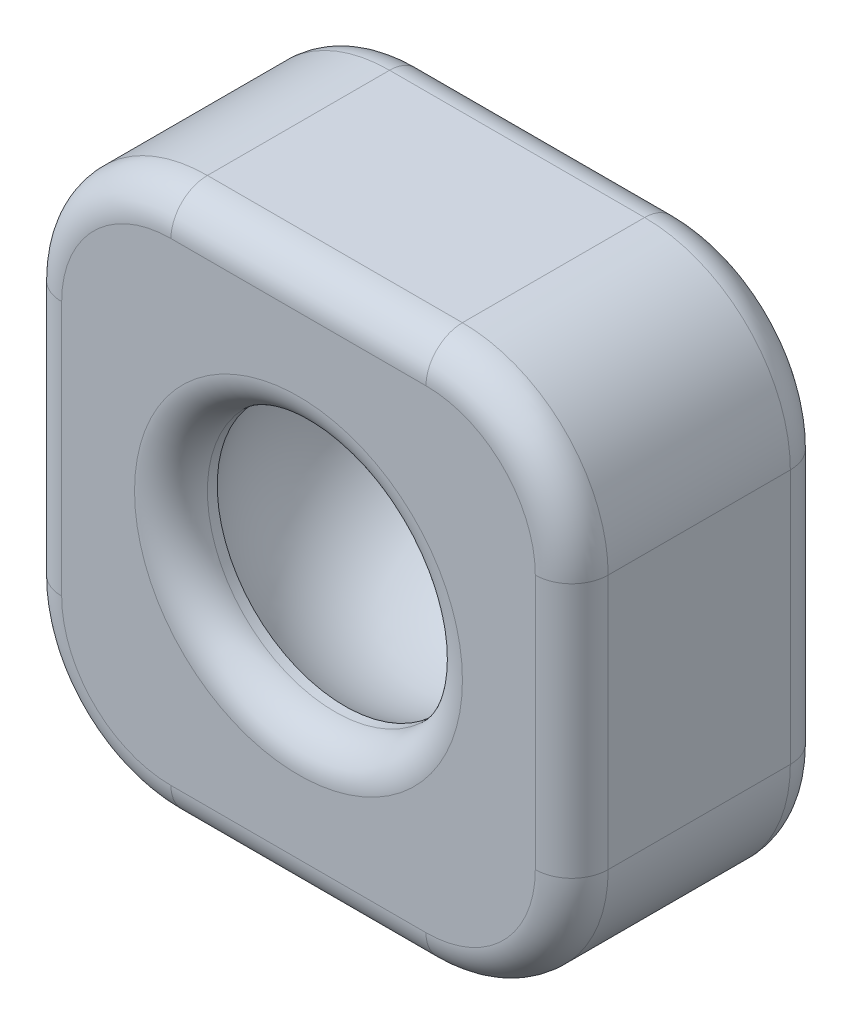
ISO-10303-21;
HEADER;
FILE_DESCRIPTION(('STEP AP214'),'2;1');
FILE_NAME('part.step','',(''),(''),'','','');
FILE_SCHEMA(('AUTOMOTIVE_DESIGN { 1 0 10303 214 1 1 1 1 }'));
ENDSEC;
DATA;
#1=APPLICATION_CONTEXT('core data for automotive mechanical design processes');
#2=APPLICATION_PROTOCOL_DEFINITION('international standard','automotive_design',2000,#1);
#3=PRODUCT_CONTEXT('',#1,'mechanical');
#4=PRODUCT('Part','Part','',(#3));
#5=PRODUCT_RELATED_PRODUCT_CATEGORY('part','',(#4));
#6=PRODUCT_DEFINITION_FORMATION('','',#4);
#7=PRODUCT_DEFINITION_CONTEXT('part definition',#1,'design');
#8=PRODUCT_DEFINITION('design','',#6,#7);
#9=PRODUCT_DEFINITION_SHAPE('','',#8);
#10=(LENGTH_UNIT() NAMED_UNIT(*) SI_UNIT(.MILLI.,.METRE.));
#11=(NAMED_UNIT(*) PLANE_ANGLE_UNIT() SI_UNIT($,.RADIAN.));
#12=(NAMED_UNIT(*) SI_UNIT($,.STERADIAN.) SOLID_ANGLE_UNIT());
#13=UNCERTAINTY_MEASURE_WITH_UNIT(LENGTH_MEASURE(1.E-05),#10,'distance_accuracy_value','');
#14=(GEOMETRIC_REPRESENTATION_CONTEXT(3) GLOBAL_UNCERTAINTY_ASSIGNED_CONTEXT((#13)) GLOBAL_UNIT_ASSIGNED_CONTEXT((#10,
#11,#12)) REPRESENTATION_CONTEXT('',''));
#15=CARTESIAN_POINT('',(0.,0.,0.));
#16=DIRECTION('',(0.,0.,1.));
#17=DIRECTION('',(1.,0.,0.));
#18=AXIS2_PLACEMENT_3D('',#15,#16,#17);
#19=CARTESIAN_POINT('',(0.,0.,8.5));
#20=DIRECTION('',(0.,0.,-1.));
#21=DIRECTION('',(-1.,0.,0.));
#22=AXIS2_PLACEMENT_3D('',#19,#20,#21);
#23=CYLINDRICAL_SURFACE('',#22,3.5);
#24=CARTESIAN_POINT('',(0.,0.,2.5));
#25=DIRECTION('',(0.,0.,1.));
#26=DIRECTION('',(1.,0.,0.));
#27=AXIS2_PLACEMENT_3D('',#24,#25,#26);
#28=CIRCLE('',#27,3.5);
#29=CARTESIAN_POINT('',(3.5,0.,2.5));
#30=VERTEX_POINT('',#29);
#31=EDGE_CURVE('E11',#30,#30,#28,.F.);
#32=ORIENTED_EDGE('',*,*,#31,.T.);
#33=EDGE_LOOP('',(#32));
#34=FACE_BOUND('',#33,.T.);
#35=CARTESIAN_POINT('',(0.,0.,2.77008968790222));
#36=DIRECTION('',(0.,0.,1.));
#37=DIRECTION('',(1.,0.,0.));
#38=AXIS2_PLACEMENT_3D('',#35,#36,#37);
#39=CIRCLE('',#38,3.5);
#40=CARTESIAN_POINT('',(3.5,0.,2.77008968790222));
#41=VERTEX_POINT('',#40);
#42=EDGE_CURVE('E368',#41,#41,#39,.T.);
#43=ORIENTED_EDGE('',*,*,#42,.T.);
#44=EDGE_LOOP('',(#43));
#45=FACE_BOUND('',#44,.T.);
#46=ADVANCED_FACE('F33',(#34,#45),#23,.F.);
#47=CARTESIAN_POINT('',(0.,0.,8.5));
#48=DIRECTION('',(0.,0.,1.));
#49=DIRECTION('',(1.,0.,0.));
#50=AXIS2_PLACEMENT_3D('',#47,#48,#49);
#51=PLANE('',#50);
#52=CARTESIAN_POINT('',(0.,0.,8.5));
#53=DIRECTION('',(0.,0.,1.));
#54=DIRECTION('',(1.,0.,0.));
#55=AXIS2_PLACEMENT_3D('',#52,#53,#54);
#56=CIRCLE('',#55,4.5);
#57=CARTESIAN_POINT('',(4.5,0.,8.5));
#58=VERTEX_POINT('',#57);
#59=EDGE_CURVE('E174',#58,#58,#56,.F.);
#60=ORIENTED_EDGE('',*,*,#59,.T.);
#61=EDGE_LOOP('',(#60));
#62=FACE_BOUND('',#61,.T.);
#63=DIRECTION('',(0.,-1.,0.));
#64=VECTOR('',#63,1.);
#65=CARTESIAN_POINT('',(-6.5,-3.49999999999999,8.5));
#66=LINE('',#65,#64);
#67=CARTESIAN_POINT('',(-6.5,3.5,8.5));
#68=VERTEX_POINT('',#67);
#69=CARTESIAN_POINT('',(-6.5,-3.5,8.5));
#70=VERTEX_POINT('',#69);
#71=EDGE_CURVE('E172',#68,#70,#66,.T.);
#72=ORIENTED_EDGE('',*,*,#71,.T.);
#73=CARTESIAN_POINT('',(-3.5,-3.5,8.5));
#74=DIRECTION('',(0.,0.,1.));
#75=DIRECTION('',(1.,0.,0.));
#76=AXIS2_PLACEMENT_3D('',#73,#74,#75);
#77=CIRCLE('',#76,3.);
#78=CARTESIAN_POINT('',(-3.5,-6.5,8.5));
#79=VERTEX_POINT('',#78);
#80=EDGE_CURVE('E153',#70,#79,#77,.T.);
#81=ORIENTED_EDGE('',*,*,#80,.T.);
#82=DIRECTION('',(1.,0.,0.));
#83=VECTOR('',#82,1.);
#84=CARTESIAN_POINT('',(3.5,-6.5,8.5));
#85=LINE('',#84,#83);
#86=CARTESIAN_POINT('',(3.5,-6.5,8.5));
#87=VERTEX_POINT('',#86);
#88=EDGE_CURVE('E161',#79,#87,#85,.T.);
#89=ORIENTED_EDGE('',*,*,#88,.T.);
#90=CARTESIAN_POINT('',(3.5,-3.5,8.5));
#91=DIRECTION('',(0.,0.,1.));
#92=DIRECTION('',(1.,0.,0.));
#93=AXIS2_PLACEMENT_3D('',#90,#91,#92);
#94=CIRCLE('',#93,3.);
#95=CARTESIAN_POINT('',(6.5,-3.5,8.5));
#96=VERTEX_POINT('',#95);
#97=EDGE_CURVE('E167',#87,#96,#94,.T.);
#98=ORIENTED_EDGE('',*,*,#97,.T.);
#99=DIRECTION('',(0.,1.,0.));
#100=VECTOR('',#99,1.);
#101=CARTESIAN_POINT('',(6.5,3.5,8.5));
#102=LINE('',#101,#100);
#103=CARTESIAN_POINT('',(6.5,3.5,8.5));
#104=VERTEX_POINT('',#103);
#105=EDGE_CURVE('E314',#96,#104,#102,.T.);
#106=ORIENTED_EDGE('',*,*,#105,.T.);
#107=CARTESIAN_POINT('',(3.5,3.5,8.5));
#108=DIRECTION('',(0.,0.,1.));
#109=DIRECTION('',(1.,0.,0.));
#110=AXIS2_PLACEMENT_3D('',#107,#108,#109);
#111=CIRCLE('',#110,3.);
#112=CARTESIAN_POINT('',(3.5,6.5,8.5));
#113=VERTEX_POINT('',#112);
#114=EDGE_CURVE('E316',#104,#113,#111,.T.);
#115=ORIENTED_EDGE('',*,*,#114,.T.);
#116=DIRECTION('',(-1.,0.,0.));
#117=VECTOR('',#116,1.);
#118=CARTESIAN_POINT('',(-3.5,6.5,8.5));
#119=LINE('',#118,#117);
#120=CARTESIAN_POINT('',(-3.5,6.5,8.5));
#121=VERTEX_POINT('',#120);
#122=EDGE_CURVE('E318',#113,#121,#119,.T.);
#123=ORIENTED_EDGE('',*,*,#122,.T.);
#124=CARTESIAN_POINT('',(-3.5,3.5,8.5));
#125=DIRECTION('',(0.,0.,1.));
#126=DIRECTION('',(1.,0.,0.));
#127=AXIS2_PLACEMENT_3D('',#124,#125,#126);
#128=CIRCLE('',#127,3.);
#129=EDGE_CURVE('E179',#121,#68,#128,.T.);
#130=ORIENTED_EDGE('',*,*,#129,.T.);
#131=EDGE_LOOP('',(#72,#81,#89,#98,#106,#115,#123,#130));
#132=FACE_BOUND('',#131,.T.);
#133=ADVANCED_FACE('F170',(#62,#132),#51,.T.);
#134=CARTESIAN_POINT('',(-7.5,7.5,8.5));
#135=DIRECTION('',(1.,0.,0.));
#136=DIRECTION('',(0.,1.,0.));
#137=AXIS2_PLACEMENT_3D('',#134,#135,#136);
#138=PLANE('',#137);
#139=DIRECTION('',(0.,0.,-1.));
#140=VECTOR('',#139,1.);
#141=CARTESIAN_POINT('',(-7.5,-3.5,8.5));
#142=LINE('',#141,#140);
#143=CARTESIAN_POINT('',(-7.5,-3.5,2.5));
#144=VERTEX_POINT('',#143);
#145=CARTESIAN_POINT('',(-7.5,-3.5,7.5));
#146=VERTEX_POINT('',#145);
#147=EDGE_CURVE('E287',#144,#146,#142,.F.);
#148=ORIENTED_EDGE('',*,*,#147,.T.);
#149=DIRECTION('',(0.,-1.,0.));
#150=VECTOR('',#149,1.);
#151=CARTESIAN_POINT('',(-7.5,3.5,7.5));
#152=LINE('',#151,#150);
#153=CARTESIAN_POINT('',(-7.5,3.5,7.5));
#154=VERTEX_POINT('',#153);
#155=EDGE_CURVE('E187',#146,#154,#152,.F.);
#156=ORIENTED_EDGE('',*,*,#155,.T.);
#157=DIRECTION('',(0.,0.,-1.));
#158=VECTOR('',#157,1.);
#159=CARTESIAN_POINT('',(-7.5,3.5,8.5));
#160=LINE('',#159,#158);
#161=CARTESIAN_POINT('',(-7.5,3.5,2.5));
#162=VERTEX_POINT('',#161);
#163=EDGE_CURVE('E308',#154,#162,#160,.T.);
#164=ORIENTED_EDGE('',*,*,#163,.T.);
#165=DIRECTION('',(0.,-1.,0.));
#166=VECTOR('',#165,1.);
#167=CARTESIAN_POINT('',(-7.5,7.5,2.5));
#168=LINE('',#167,#166);
#169=EDGE_CURVE('E185',#162,#144,#168,.T.);
#170=ORIENTED_EDGE('',*,*,#169,.T.);
#171=EDGE_LOOP('',(#148,#156,#164,#170));
#172=FACE_BOUND('',#171,.T.);
#173=ADVANCED_FACE('F331',(#172),#138,.F.);
#174=CARTESIAN_POINT('',(-7.5,-7.5,8.5));
#175=DIRECTION('',(0.,1.,0.));
#176=DIRECTION('',(0.,0.,1.));
#177=AXIS2_PLACEMENT_3D('',#174,#175,#176);
#178=PLANE('',#177);
#179=DIRECTION('',(0.,0.,-1.));
#180=VECTOR('',#179,1.);
#181=CARTESIAN_POINT('',(3.5,-7.5,8.5));
#182=LINE('',#181,#180);
#183=CARTESIAN_POINT('',(3.5,-7.5,2.5));
#184=VERTEX_POINT('',#183);
#185=CARTESIAN_POINT('',(3.5,-7.5,7.5));
#186=VERTEX_POINT('',#185);
#187=EDGE_CURVE('E292',#184,#186,#182,.F.);
#188=ORIENTED_EDGE('',*,*,#187,.T.);
#189=DIRECTION('',(1.,0.,0.));
#190=VECTOR('',#189,1.);
#191=CARTESIAN_POINT('',(-3.5,-7.5,7.5));
#192=LINE('',#191,#190);
#193=CARTESIAN_POINT('',(-3.5,-7.5,7.5));
#194=VERTEX_POINT('',#193);
#195=EDGE_CURVE('E212',#186,#194,#192,.F.);
#196=ORIENTED_EDGE('',*,*,#195,.T.);
#197=DIRECTION('',(0.,0.,-1.));
#198=VECTOR('',#197,1.);
#199=CARTESIAN_POINT('',(-3.5,-7.5,8.5));
#200=LINE('',#199,#198);
#201=CARTESIAN_POINT('',(-3.5,-7.5,2.5));
#202=VERTEX_POINT('',#201);
#203=EDGE_CURVE('E285',#194,#202,#200,.T.);
#204=ORIENTED_EDGE('',*,*,#203,.T.);
#205=DIRECTION('',(1.,0.,0.));
#206=VECTOR('',#205,1.);
#207=CARTESIAN_POINT('',(-7.5,-7.5,2.5));
#208=LINE('',#207,#206);
#209=EDGE_CURVE('E210',#202,#184,#208,.T.);
#210=ORIENTED_EDGE('',*,*,#209,.T.);
#211=EDGE_LOOP('',(#188,#196,#204,#210));
#212=FACE_BOUND('',#211,.T.);
#213=ADVANCED_FACE('F290',(#212),#178,.F.);
#214=CARTESIAN_POINT('',(7.5,-7.5,8.5));
#215=DIRECTION('',(-1.,0.,0.));
#216=DIRECTION('',(0.,0.,1.));
#217=AXIS2_PLACEMENT_3D('',#214,#215,#216);
#218=PLANE('',#217);
#219=DIRECTION('',(0.,0.,-1.));
#220=VECTOR('',#219,1.);
#221=CARTESIAN_POINT('',(7.5,3.5,8.5));
#222=LINE('',#221,#220);
#223=CARTESIAN_POINT('',(7.5,3.5,2.5));
#224=VERTEX_POINT('',#223);
#225=CARTESIAN_POINT('',(7.5,3.5,7.5));
#226=VERTEX_POINT('',#225);
#227=EDGE_CURVE('E298',#224,#226,#222,.F.);
#228=ORIENTED_EDGE('',*,*,#227,.T.);
#229=DIRECTION('',(0.,1.,0.));
#230=VECTOR('',#229,1.);
#231=CARTESIAN_POINT('',(7.5,-3.5,7.5));
#232=LINE('',#231,#230);
#233=CARTESIAN_POINT('',(7.5,-3.5,7.5));
#234=VERTEX_POINT('',#233);
#235=EDGE_CURVE('E204',#226,#234,#232,.F.);
#236=ORIENTED_EDGE('',*,*,#235,.T.);
#237=DIRECTION('',(0.,0.,-1.));
#238=VECTOR('',#237,1.);
#239=CARTESIAN_POINT('',(7.5,-3.5,8.5));
#240=LINE('',#239,#238);
#241=CARTESIAN_POINT('',(7.5,-3.5,2.5));
#242=VERTEX_POINT('',#241);
#243=EDGE_CURVE('E293',#234,#242,#240,.T.);
#244=ORIENTED_EDGE('',*,*,#243,.T.);
#245=DIRECTION('',(0.,1.,0.));
#246=VECTOR('',#245,1.);
#247=CARTESIAN_POINT('',(7.5,-7.5,2.5));
#248=LINE('',#247,#246);
#249=EDGE_CURVE('E202',#242,#224,#248,.T.);
#250=ORIENTED_EDGE('',*,*,#249,.T.);
#251=EDGE_LOOP('',(#228,#236,#244,#250));
#252=FACE_BOUND('',#251,.T.);
#253=ADVANCED_FACE('F361',(#252),#218,.F.);
#254=CARTESIAN_POINT('',(7.5,7.5,8.5));
#255=DIRECTION('',(0.,-1.,0.));
#256=DIRECTION('',(1.,0.,0.));
#257=AXIS2_PLACEMENT_3D('',#254,#255,#256);
#258=PLANE('',#257);
#259=DIRECTION('',(0.,0.,-1.));
#260=VECTOR('',#259,1.);
#261=CARTESIAN_POINT('',(-3.5,7.5,8.5));
#262=LINE('',#261,#260);
#263=CARTESIAN_POINT('',(-3.5,7.5,2.5));
#264=VERTEX_POINT('',#263);
#265=CARTESIAN_POINT('',(-3.5,7.5,7.5));
#266=VERTEX_POINT('',#265);
#267=EDGE_CURVE('E295',#264,#266,#262,.F.);
#268=ORIENTED_EDGE('',*,*,#267,.T.);
#269=DIRECTION('',(-1.,0.,0.));
#270=VECTOR('',#269,1.);
#271=CARTESIAN_POINT('',(3.5,7.5,7.5));
#272=LINE('',#271,#270);
#273=CARTESIAN_POINT('',(3.5,7.5,7.5));
#274=VERTEX_POINT('',#273);
#275=EDGE_CURVE('E195',#266,#274,#272,.F.);
#276=ORIENTED_EDGE('',*,*,#275,.T.);
#277=DIRECTION('',(0.,0.,-1.));
#278=VECTOR('',#277,1.);
#279=CARTESIAN_POINT('',(3.5,7.5,8.5));
#280=LINE('',#279,#278);
#281=CARTESIAN_POINT('',(3.5,7.5,2.5));
#282=VERTEX_POINT('',#281);
#283=EDGE_CURVE('E304',#274,#282,#280,.T.);
#284=ORIENTED_EDGE('',*,*,#283,.T.);
#285=DIRECTION('',(-1.,0.,0.));
#286=VECTOR('',#285,1.);
#287=CARTESIAN_POINT('',(7.5,7.5,2.5));
#288=LINE('',#287,#286);
#289=EDGE_CURVE('E193',#282,#264,#288,.T.);
#290=ORIENTED_EDGE('',*,*,#289,.T.);
#291=EDGE_LOOP('',(#268,#276,#284,#290));
#292=FACE_BOUND('',#291,.T.);
#293=ADVANCED_FACE('F379',(#292),#258,.F.);
#294=CARTESIAN_POINT('',(0.,0.,7.5));
#295=DIRECTION('',(0.,0.,1.));
#296=DIRECTION('',(1.,0.,0.));
#297=AXIS2_PLACEMENT_3D('',#294,#295,#296);
#298=CIRCLE('',#297,3.5);
#299=CARTESIAN_POINT('',(3.5,0.,7.5));
#300=VERTEX_POINT('',#299);
#301=EDGE_CURVE('E168',#300,#300,#298,.T.);
#302=ORIENTED_EDGE('',*,*,#301,.T.);
#303=EDGE_LOOP('',(#302));
#304=FACE_BOUND('',#303,.T.);
#305=CARTESIAN_POINT('',(0.,0.,7.22991031209778));
#306=DIRECTION('',(0.,0.,1.));
#307=DIRECTION('',(1.,0.,0.));
#308=AXIS2_PLACEMENT_3D('',#305,#306,#307);
#309=CIRCLE('',#308,3.5);
#310=CARTESIAN_POINT('',(3.5,0.,7.22991031209777));
#311=VERTEX_POINT('',#310);
#312=EDGE_CURVE('E247',#311,#311,#309,.T.);
#313=ORIENTED_EDGE('',*,*,#312,.F.);
#314=EDGE_LOOP('',(#313));
#315=FACE_BOUND('',#314,.T.);
#316=ADVANCED_FACE('F377',(#304,#315),#23,.F.);
#317=CARTESIAN_POINT('',(0.,0.,1.5));
#318=DIRECTION('',(0.,0.,1.));
#319=DIRECTION('',(1.,0.,0.));
#320=AXIS2_PLACEMENT_3D('',#317,#318,#319);
#321=PLANE('',#320);
#322=DIRECTION('',(-1.,0.,0.));
#323=VECTOR('',#322,1.);
#324=CARTESIAN_POINT('',(0.,6.5,1.5));
#325=LINE('',#324,#323);
#326=CARTESIAN_POINT('',(-3.5,6.5,1.5));
#327=VERTEX_POINT('',#326);
#328=CARTESIAN_POINT('',(3.5,6.5,1.5));
#329=VERTEX_POINT('',#328);
#330=EDGE_CURVE('E50',#327,#329,#325,.F.);
#331=ORIENTED_EDGE('',*,*,#330,.T.);
#332=CARTESIAN_POINT('',(3.5,3.5,1.5));
#333=DIRECTION('',(0.,0.,1.));
#334=DIRECTION('',(1.,0.,0.));
#335=AXIS2_PLACEMENT_3D('',#332,#333,#334);
#336=CIRCLE('',#335,3.);
#337=CARTESIAN_POINT('',(6.5,3.5,1.5));
#338=VERTEX_POINT('',#337);
#339=EDGE_CURVE('E42',#329,#338,#336,.F.);
#340=ORIENTED_EDGE('',*,*,#339,.T.);
#341=DIRECTION('',(0.,1.,0.));
#342=VECTOR('',#341,1.);
#343=CARTESIAN_POINT('',(6.5,0.,1.5));
#344=LINE('',#343,#342);
#345=CARTESIAN_POINT('',(6.5,-3.5,1.5));
#346=VERTEX_POINT('',#345);
#347=EDGE_CURVE('E217',#338,#346,#344,.F.);
#348=ORIENTED_EDGE('',*,*,#347,.T.);
#349=CARTESIAN_POINT('',(3.5,-3.5,1.5));
#350=DIRECTION('',(0.,0.,1.));
#351=DIRECTION('',(1.,0.,0.));
#352=AXIS2_PLACEMENT_3D('',#349,#350,#351);
#353=CIRCLE('',#352,3.);
#354=CARTESIAN_POINT('',(3.5,-6.5,1.5));
#355=VERTEX_POINT('',#354);
#356=EDGE_CURVE('E219',#346,#355,#353,.F.);
#357=ORIENTED_EDGE('',*,*,#356,.T.);
#358=DIRECTION('',(1.,0.,0.));
#359=VECTOR('',#358,1.);
#360=CARTESIAN_POINT('',(0.,-6.5,1.5));
#361=LINE('',#360,#359);
#362=CARTESIAN_POINT('',(-3.5,-6.5,1.5));
#363=VERTEX_POINT('',#362);
#364=EDGE_CURVE('E221',#355,#363,#361,.F.);
#365=ORIENTED_EDGE('',*,*,#364,.T.);
#366=CARTESIAN_POINT('',(-3.5,-3.5,1.5));
#367=DIRECTION('',(0.,0.,1.));
#368=DIRECTION('',(1.,0.,0.));
#369=AXIS2_PLACEMENT_3D('',#366,#367,#368);
#370=CIRCLE('',#369,3.);
#371=CARTESIAN_POINT('',(-6.5,-3.5,1.5));
#372=VERTEX_POINT('',#371);
#373=EDGE_CURVE('E223',#363,#372,#370,.F.);
#374=ORIENTED_EDGE('',*,*,#373,.T.);
#375=DIRECTION('',(0.,-1.,0.));
#376=VECTOR('',#375,1.);
#377=CARTESIAN_POINT('',(-6.5,0.,1.5));
#378=LINE('',#377,#376);
#379=CARTESIAN_POINT('',(-6.5,3.5,1.5));
#380=VERTEX_POINT('',#379);
#381=EDGE_CURVE('E225',#372,#380,#378,.F.);
#382=ORIENTED_EDGE('',*,*,#381,.T.);
#383=CARTESIAN_POINT('',(-3.5,3.5,1.5));
#384=DIRECTION('',(0.,0.,1.));
#385=DIRECTION('',(1.,0.,0.));
#386=AXIS2_PLACEMENT_3D('',#383,#384,#385);
#387=CIRCLE('',#386,3.);
#388=EDGE_CURVE('E55',#380,#327,#387,.F.);
#389=ORIENTED_EDGE('',*,*,#388,.T.);
#390=EDGE_LOOP('',(#331,#340,#348,#357,#365,#374,#382,#389));
#391=FACE_BOUND('',#390,.T.);
#392=CARTESIAN_POINT('',(0.,0.,1.5));
#393=DIRECTION('',(0.,0.,1.));
#394=DIRECTION('',(1.,0.,0.));
#395=AXIS2_PLACEMENT_3D('',#392,#393,#394);
#396=CIRCLE('',#395,4.5);
#397=CARTESIAN_POINT('',(4.5,0.,1.5));
#398=VERTEX_POINT('',#397);
#399=EDGE_CURVE('E214',#398,#398,#396,.T.);
#400=ORIENTED_EDGE('',*,*,#399,.T.);
#401=EDGE_LOOP('',(#400));
#402=FACE_BOUND('',#401,.T.);
#403=ADVANCED_FACE('F347',(#391,#402),#321,.F.);
#404=CARTESIAN_POINT('',(0.,0.,5.));
#405=DIRECTION('',(0.,0.,1.));
#406=DIRECTION('',(1.,0.,0.));
#407=AXIS2_PLACEMENT_3D('',#404,#405,#406);
#408=SPHERICAL_SURFACE('',#407,4.15);
#409=CARTESIAN_POINT('',(3.5,0.,2.77008968790222));
#410=CARTESIAN_POINT('',(3.52635348393642,0.,2.81145259186412));
#411=CARTESIAN_POINT('',(3.55197305961561,0.,2.85328305285319));
#412=CARTESIAN_POINT('',(3.60171367964725,0.,2.9378256398671));
#413=CARTESIAN_POINT('',(3.62583472399969,0.,2.98053776589194));
#414=CARTESIAN_POINT('',(3.67254756656554,0.,3.06679023395881));
#415=CARTESIAN_POINT('',(3.69513936477894,0.,3.11033057600084));
#416=CARTESIAN_POINT('',(3.73876542697145,0.,3.19818468920875));
#417=CARTESIAN_POINT('',(3.75979969095056,0.,3.24249846037462));
#418=CARTESIAN_POINT('',(3.80028421895757,0.,3.33184375240433));
#419=CARTESIAN_POINT('',(3.81973448298547,0.,3.37687527326816));
#420=CARTESIAN_POINT('',(3.85702657247401,0.,3.46759946183843));
#421=CARTESIAN_POINT('',(3.87486839793464,0.,3.51329212954485));
#422=CARTESIAN_POINT('',(3.9089211835471,0.,3.60528118368758));
#423=CARTESIAN_POINT('',(3.92513214369893,0.,3.65157757012388));
#424=CARTESIAN_POINT('',(3.95590282432428,0.,3.74471587329271));
#425=CARTESIAN_POINT('',(3.97046254479779,0.,3.79155779002524));
#426=CARTESIAN_POINT('',(3.99791244637826,0.,3.88572828010737));
#427=CARTESIAN_POINT('',(4.01080262748521,0.,3.93305685345698));
#428=CARTESIAN_POINT('',(4.03489724920953,0.,4.02814117132465));
#429=CARTESIAN_POINT('',(4.0461016898269,0.,4.07589691584272));
#430=CARTESIAN_POINT('',(4.06681074814004,0.,4.17177555373345));
#431=CARTESIAN_POINT('',(4.07631536583581,0.,4.21989844710612));
#432=CARTESIAN_POINT('',(4.09361283232782,0.,4.31645089892935));
#433=CARTESIAN_POINT('',(4.10140568112405,0.,4.36488045737991));
#434=CARTESIAN_POINT('',(4.11526981529058,0.,4.46198537014902));
#435=CARTESIAN_POINT('',(4.12134110066087,0.,4.51066072446757));
#436=CARTESIAN_POINT('',(4.13175447721552,0.,4.60819605083102));
#437=CARTESIAN_POINT('',(4.13609656839989,0.,4.65705602287593));
#438=CARTESIAN_POINT('',(4.14304609917873,0.,4.75489917451182));
#439=CARTESIAN_POINT('',(4.1456535387732,0.,4.80388235410282));
#440=CARTESIAN_POINT('',(4.14913048918384,0.,4.90191035579588));
#441=CARTESIAN_POINT('',(4.15,0.,4.95095517789794));
#442=CARTESIAN_POINT('',(4.15,0.,5.04904482210206));
#443=CARTESIAN_POINT('',(4.14913048918384,0.,5.09808964420412));
#444=CARTESIAN_POINT('',(4.1456535387732,0.,5.19611764589718));
#445=CARTESIAN_POINT('',(4.14304609917873,0.,5.24510082548818));
#446=CARTESIAN_POINT('',(4.13609656839989,0.,5.34294397712407));
#447=CARTESIAN_POINT('',(4.13175447721552,0.,5.39180394916897));
#448=CARTESIAN_POINT('',(4.12134110066087,0.,5.48933927553243));
#449=CARTESIAN_POINT('',(4.11526981529058,0.,5.53801462985098));
#450=CARTESIAN_POINT('',(4.10140568112405,0.,5.63511954262009));
#451=CARTESIAN_POINT('',(4.09361283232782,0.,5.68354910107065));
#452=CARTESIAN_POINT('',(4.07631536583581,0.,5.78010155289388));
#453=CARTESIAN_POINT('',(4.06681074814004,0.,5.82822444626655));
#454=CARTESIAN_POINT('',(4.0461016898269,0.,5.92410308415728));
#455=CARTESIAN_POINT('',(4.03489724920953,0.,5.97185882867534));
#456=CARTESIAN_POINT('',(4.01080262748521,0.,6.06694314654302));
#457=CARTESIAN_POINT('',(3.99791244637826,0.,6.11427171989263));
#458=CARTESIAN_POINT('',(3.9704625447978,0.,6.20844220997476));
#459=CARTESIAN_POINT('',(3.95590282432428,0.,6.25528412670729));
#460=CARTESIAN_POINT('',(3.92513214369893,0.,6.34842242987612));
#461=CARTESIAN_POINT('',(3.9089211835471,0.,6.39471881631242));
#462=CARTESIAN_POINT('',(3.87486839793464,0.,6.48670787045515));
#463=CARTESIAN_POINT('',(3.85702657247401,0.,6.53240053816157));
#464=CARTESIAN_POINT('',(3.81973448298547,0.,6.62312472673183));
#465=CARTESIAN_POINT('',(3.80028421895757,0.,6.66815624759567));
#466=CARTESIAN_POINT('',(3.75979969095056,0.,6.75750153962538));
#467=CARTESIAN_POINT('',(3.73876542697145,0.,6.80181531079125));
#468=CARTESIAN_POINT('',(3.69513936477894,0.,6.88966942399916));
#469=CARTESIAN_POINT('',(3.67254756656554,0.,6.93320976604119));
#470=CARTESIAN_POINT('',(3.62583472399969,0.,7.01946223410806));
#471=CARTESIAN_POINT('',(3.60171367964725,0.,7.06217436013289));
#472=CARTESIAN_POINT('',(3.55197305961562,0.,7.1467169471468));
#473=CARTESIAN_POINT('',(3.52635348393642,0.,7.18854740813588));
#474=CARTESIAN_POINT('',(3.5,0.,7.22991031209777));
#475=B_SPLINE_CURVE_WITH_KNOTS('',3,(#409,#410,#411,#412,#413,#414,#415,#416,#417,#418,#419,
#420,#421,#422,#423,#424,#425,#426,#427,#428,#429,#430,#431,#432,#433,#434,#435,#436,#437,#438,
#439,#440,#441,#442,#443,#444,#445,#446,#447,#448,#449,#450,#451,#452,#453,#454,#455,#456,#457,
#458,#459,#460,#461,#462,#463,#464,#465,#466,#467,#468,#469,#470,#471,#472,#473,#474),
.UNSPECIFIED.,.F.,.F.,(4,2,2,2,2,2,2,2,2,2,2,2,2,2,2,2,2,2,2,2,2,2,2,2,2,2,2,2,2,2,2,2,4),(0.,
0.147126761597871,0.294253523195742,0.441380284793612,0.588507046391483,0.735633807989354,
0.882760569587225,1.0298873311851,1.17701409278297,1.32414085438084,1.47126761597871,
1.61839437757658,1.76552113917445,1.91264790077232,2.05977466237019,2.20690142396806,
2.35402818556593,2.5011549471638,2.64828170876168,2.79540847035955,2.94253523195742,
3.08966199355529,3.23678875515316,3.38391551675103,3.5310422783489,3.67816903994677,
3.82529580154464,3.97242256314251,4.11954932474038,4.26667608633825,4.41380284793612,
4.560929609534,4.70805637113187),.UNSPECIFIED.);
#476=EDGE_CURVE('BSEAM375',#41,#311,#475,.T.);
#477=ORIENTED_EDGE('',*,*,#42,.F.);
#478=ORIENTED_EDGE('',*,*,#312,.T.);
#479=ORIENTED_EDGE('',*,*,#476,.T.);
#480=ORIENTED_EDGE('',*,*,#476,.F.);
#481=EDGE_LOOP('',(#477,#479,#478,#480));
#482=FACE_BOUND('',#481,.T.);
#483=ADVANCED_FACE('F375',(#482),#408,.F.);
#484=CARTESIAN_POINT('',(3.5,-3.5,8.5));
#485=DIRECTION('',(0.,0.,-1.));
#486=DIRECTION('',(-1.,0.,0.));
#487=AXIS2_PLACEMENT_3D('',#484,#485,#486);
#488=CYLINDRICAL_SURFACE('',#487,4.);
#489=ORIENTED_EDGE('',*,*,#243,.F.);
#490=CARTESIAN_POINT('',(3.5,-3.5,7.5));
#491=DIRECTION('',(0.,0.,1.));
#492=DIRECTION('',(1.,0.,0.));
#493=AXIS2_PLACEMENT_3D('',#490,#491,#492);
#494=CIRCLE('',#493,4.);
#495=EDGE_CURVE('E208',#234,#186,#494,.F.);
#496=ORIENTED_EDGE('',*,*,#495,.T.);
#497=ORIENTED_EDGE('',*,*,#187,.F.);
#498=CARTESIAN_POINT('',(3.5,-3.5,2.5));
#499=DIRECTION('',(0.,0.,1.));
#500=DIRECTION('',(1.,0.,0.));
#501=AXIS2_PLACEMENT_3D('',#498,#499,#500);
#502=CIRCLE('',#501,4.);
#503=EDGE_CURVE('E206',#184,#242,#502,.T.);
#504=ORIENTED_EDGE('',*,*,#503,.T.);
#505=EDGE_LOOP('',(#489,#496,#497,#504));
#506=FACE_BOUND('',#505,.T.);
#507=ADVANCED_FACE('F401',(#506),#488,.T.);
#508=CARTESIAN_POINT('',(3.5,3.5,8.5));
#509=DIRECTION('',(0.,0.,-1.));
#510=DIRECTION('',(-1.,0.,0.));
#511=AXIS2_PLACEMENT_3D('',#508,#509,#510);
#512=CYLINDRICAL_SURFACE('',#511,4.);
#513=ORIENTED_EDGE('',*,*,#283,.F.);
#514=CARTESIAN_POINT('',(3.5,3.5,7.5));
#515=DIRECTION('',(0.,0.,1.));
#516=DIRECTION('',(1.,0.,0.));
#517=AXIS2_PLACEMENT_3D('',#514,#515,#516);
#518=CIRCLE('',#517,4.);
#519=EDGE_CURVE('E200',#274,#226,#518,.F.);
#520=ORIENTED_EDGE('',*,*,#519,.T.);
#521=ORIENTED_EDGE('',*,*,#227,.F.);
#522=CARTESIAN_POINT('',(3.5,3.5,2.5));
#523=DIRECTION('',(0.,0.,1.));
#524=DIRECTION('',(1.,0.,0.));
#525=AXIS2_PLACEMENT_3D('',#522,#523,#524);
#526=CIRCLE('',#525,4.);
#527=EDGE_CURVE('E197',#224,#282,#526,.T.);
#528=ORIENTED_EDGE('',*,*,#527,.T.);
#529=EDGE_LOOP('',(#513,#520,#521,#528));
#530=FACE_BOUND('',#529,.T.);
#531=ADVANCED_FACE('F366',(#530),#512,.T.);
#532=CARTESIAN_POINT('',(-3.5,3.5,8.5));
#533=DIRECTION('',(0.,0.,-1.));
#534=DIRECTION('',(-1.,0.,0.));
#535=AXIS2_PLACEMENT_3D('',#532,#533,#534);
#536=CYLINDRICAL_SURFACE('',#535,4.);
#537=ORIENTED_EDGE('',*,*,#163,.F.);
#538=CARTESIAN_POINT('',(-3.5,3.5,7.5));
#539=DIRECTION('',(0.,0.,1.));
#540=DIRECTION('',(1.,0.,0.));
#541=AXIS2_PLACEMENT_3D('',#538,#539,#540);
#542=CIRCLE('',#541,4.);
#543=EDGE_CURVE('E191',#154,#266,#542,.F.);
#544=ORIENTED_EDGE('',*,*,#543,.T.);
#545=ORIENTED_EDGE('',*,*,#267,.F.);
#546=CARTESIAN_POINT('',(-3.5,3.5,2.5));
#547=DIRECTION('',(0.,0.,1.));
#548=DIRECTION('',(1.,0.,0.));
#549=AXIS2_PLACEMENT_3D('',#546,#547,#548);
#550=CIRCLE('',#549,4.);
#551=EDGE_CURVE('E189',#264,#162,#550,.T.);
#552=ORIENTED_EDGE('',*,*,#551,.T.);
#553=EDGE_LOOP('',(#537,#544,#545,#552));
#554=FACE_BOUND('',#553,.T.);
#555=ADVANCED_FACE('F333',(#554),#536,.T.);
#556=CARTESIAN_POINT('',(-3.5,-3.5,8.5));
#557=DIRECTION('',(0.,0.,-1.));
#558=DIRECTION('',(-1.,0.,0.));
#559=AXIS2_PLACEMENT_3D('',#556,#557,#558);
#560=CYLINDRICAL_SURFACE('',#559,4.);
#561=ORIENTED_EDGE('',*,*,#203,.F.);
#562=CARTESIAN_POINT('',(-3.5,-3.5,7.5));
#563=DIRECTION('',(0.,0.,1.));
#564=DIRECTION('',(1.,0.,0.));
#565=AXIS2_PLACEMENT_3D('',#562,#563,#564);
#566=CIRCLE('',#565,4.);
#567=EDGE_CURVE('E155',#194,#146,#566,.F.);
#568=ORIENTED_EDGE('',*,*,#567,.T.);
#569=ORIENTED_EDGE('',*,*,#147,.F.);
#570=CARTESIAN_POINT('',(-3.5,-3.5,2.5));
#571=DIRECTION('',(0.,0.,1.));
#572=DIRECTION('',(1.,0.,0.));
#573=AXIS2_PLACEMENT_3D('',#570,#571,#572);
#574=CIRCLE('',#573,4.);
#575=EDGE_CURVE('E177',#144,#202,#574,.T.);
#576=ORIENTED_EDGE('',*,*,#575,.T.);
#577=EDGE_LOOP('',(#561,#568,#569,#576));
#578=FACE_BOUND('',#577,.T.);
#579=ADVANCED_FACE('F284',(#578),#560,.T.);
#580=CARTESIAN_POINT('',(0.,0.,7.5));
#581=DIRECTION('',(0.,0.,1.));
#582=DIRECTION('',(1.,0.,0.));
#583=AXIS2_PLACEMENT_3D('',#580,#581,#582);
#584=TOROIDAL_SURFACE('',#583,4.5,1.);
#585=ORIENTED_EDGE('',*,*,#59,.F.);
#586=EDGE_LOOP('',(#585));
#587=FACE_BOUND('',#586,.T.);
#588=ORIENTED_EDGE('',*,*,#301,.F.);
#589=EDGE_LOOP('',(#588));
#590=FACE_BOUND('',#589,.T.);
#591=ADVANCED_FACE('F419',(#587,#590),#584,.T.);
#592=CARTESIAN_POINT('',(3.5,3.5,7.5));
#593=DIRECTION('',(0.,0.,1.));
#594=DIRECTION('',(1.,0.,0.));
#595=AXIS2_PLACEMENT_3D('',#592,#593,#594);
#596=TOROIDAL_SURFACE('',#595,3.,1.);
#597=CARTESIAN_POINT('',(6.5,3.5,7.5));
#598=DIRECTION('',(0.,-1.,0.));
#599=DIRECTION('',(0.,0.,-1.));
#600=AXIS2_PLACEMENT_3D('',#597,#598,#599);
#601=CIRCLE('',#600,1.);
#602=EDGE_CURVE('E241',#226,#104,#601,.T.);
#603=ORIENTED_EDGE('',*,*,#602,.F.);
#604=ORIENTED_EDGE('',*,*,#519,.F.);
#605=CARTESIAN_POINT('',(3.5,6.5,7.5));
#606=DIRECTION('',(-1.,0.,0.));
#607=DIRECTION('',(0.,0.,1.));
#608=AXIS2_PLACEMENT_3D('',#605,#606,#607);
#609=CIRCLE('',#608,1.);
#610=EDGE_CURVE('E244',#113,#274,#609,.T.);
#611=ORIENTED_EDGE('',*,*,#610,.F.);
#612=ORIENTED_EDGE('',*,*,#114,.F.);
#613=EDGE_LOOP('',(#603,#604,#611,#612));
#614=FACE_BOUND('',#613,.T.);
#615=ADVANCED_FACE('F422',(#614),#596,.T.);
#616=CARTESIAN_POINT('',(0.,6.5,7.5));
#617=DIRECTION('',(1.,0.,0.));
#618=DIRECTION('',(0.,1.,0.));
#619=AXIS2_PLACEMENT_3D('',#616,#617,#618);
#620=CYLINDRICAL_SURFACE('',#619,1.);
#621=ORIENTED_EDGE('',*,*,#610,.T.);
#622=ORIENTED_EDGE('',*,*,#275,.F.);
#623=CARTESIAN_POINT('',(-3.5,6.5,7.5));
#624=DIRECTION('',(-1.,0.,0.));
#625=DIRECTION('',(0.,0.,1.));
#626=AXIS2_PLACEMENT_3D('',#623,#624,#625);
#627=CIRCLE('',#626,1.);
#628=EDGE_CURVE('E238',#121,#266,#627,.T.);
#629=ORIENTED_EDGE('',*,*,#628,.F.);
#630=ORIENTED_EDGE('',*,*,#122,.F.);
#631=EDGE_LOOP('',(#621,#622,#629,#630));
#632=FACE_BOUND('',#631,.T.);
#633=ADVANCED_FACE('F439',(#632),#620,.T.);
#634=CARTESIAN_POINT('',(6.5,0.,7.5));
#635=DIRECTION('',(0.,-1.,0.));
#636=DIRECTION('',(0.,0.,-1.));
#637=AXIS2_PLACEMENT_3D('',#634,#635,#636);
#638=CYLINDRICAL_SURFACE('',#637,1.);
#639=ORIENTED_EDGE('',*,*,#602,.T.);
#640=ORIENTED_EDGE('',*,*,#105,.F.);
#641=CARTESIAN_POINT('',(6.5,-3.5,7.5));
#642=DIRECTION('',(0.,-1.,0.));
#643=DIRECTION('',(0.,0.,-1.));
#644=AXIS2_PLACEMENT_3D('',#641,#642,#643);
#645=CIRCLE('',#644,1.);
#646=EDGE_CURVE('E235',#234,#96,#645,.T.);
#647=ORIENTED_EDGE('',*,*,#646,.F.);
#648=ORIENTED_EDGE('',*,*,#235,.F.);
#649=EDGE_LOOP('',(#639,#640,#647,#648));
#650=FACE_BOUND('',#649,.T.);
#651=ADVANCED_FACE('F436',(#650),#638,.T.);
#652=CARTESIAN_POINT('',(-3.5,3.5,7.5));
#653=DIRECTION('',(0.,0.,1.));
#654=DIRECTION('',(1.,0.,0.));
#655=AXIS2_PLACEMENT_3D('',#652,#653,#654);
#656=TOROIDAL_SURFACE('',#655,3.,1.);
#657=ORIENTED_EDGE('',*,*,#628,.T.);
#658=ORIENTED_EDGE('',*,*,#543,.F.);
#659=CARTESIAN_POINT('',(-6.5,3.5,7.5));
#660=DIRECTION('',(0.,-1.,0.));
#661=DIRECTION('',(0.,0.,-1.));
#662=AXIS2_PLACEMENT_3D('',#659,#660,#661);
#663=CIRCLE('',#662,1.);
#664=EDGE_CURVE('E232',#68,#154,#663,.T.);
#665=ORIENTED_EDGE('',*,*,#664,.F.);
#666=ORIENTED_EDGE('',*,*,#129,.F.);
#667=EDGE_LOOP('',(#657,#658,#665,#666));
#668=FACE_BOUND('',#667,.T.);
#669=ADVANCED_FACE('F325',(#668),#656,.T.);
#670=CARTESIAN_POINT('',(3.5,-3.5,7.5));
#671=DIRECTION('',(0.,0.,1.));
#672=DIRECTION('',(1.,0.,0.));
#673=AXIS2_PLACEMENT_3D('',#670,#671,#672);
#674=TOROIDAL_SURFACE('',#673,3.,1.);
#675=ORIENTED_EDGE('',*,*,#646,.T.);
#676=ORIENTED_EDGE('',*,*,#97,.F.);
#677=CARTESIAN_POINT('',(3.5,-6.5,7.5));
#678=DIRECTION('',(-1.,0.,0.));
#679=DIRECTION('',(0.,0.,1.));
#680=AXIS2_PLACEMENT_3D('',#677,#678,#679);
#681=CIRCLE('',#680,1.);
#682=EDGE_CURVE('E164',#186,#87,#681,.T.);
#683=ORIENTED_EDGE('',*,*,#682,.F.);
#684=ORIENTED_EDGE('',*,*,#495,.F.);
#685=EDGE_LOOP('',(#675,#676,#683,#684));
#686=FACE_BOUND('',#685,.T.);
#687=ADVANCED_FACE('F430',(#686),#674,.T.);
#688=CARTESIAN_POINT('',(-6.5,0.,7.5));
#689=DIRECTION('',(0.,1.,0.));
#690=DIRECTION('',(-1.,0.,0.));
#691=AXIS2_PLACEMENT_3D('',#688,#689,#690);
#692=CYLINDRICAL_SURFACE('',#691,1.);
#693=ORIENTED_EDGE('',*,*,#664,.T.);
#694=ORIENTED_EDGE('',*,*,#155,.F.);
#695=CARTESIAN_POINT('',(-6.5,-3.5,7.5));
#696=DIRECTION('',(0.,-1.,0.));
#697=DIRECTION('',(0.,0.,-1.));
#698=AXIS2_PLACEMENT_3D('',#695,#696,#697);
#699=CIRCLE('',#698,1.);
#700=EDGE_CURVE('E158',#70,#146,#699,.T.);
#701=ORIENTED_EDGE('',*,*,#700,.F.);
#702=ORIENTED_EDGE('',*,*,#71,.F.);
#703=EDGE_LOOP('',(#693,#694,#701,#702));
#704=FACE_BOUND('',#703,.T.);
#705=ADVANCED_FACE('F328',(#704),#692,.T.);
#706=CARTESIAN_POINT('',(0.,-6.5,7.5));
#707=DIRECTION('',(-1.,0.,0.));
#708=DIRECTION('',(0.,0.,1.));
#709=AXIS2_PLACEMENT_3D('',#706,#707,#708);
#710=CYLINDRICAL_SURFACE('',#709,1.);
#711=ORIENTED_EDGE('',*,*,#682,.T.);
#712=ORIENTED_EDGE('',*,*,#88,.F.);
#713=CARTESIAN_POINT('',(-3.5,-6.5,7.5));
#714=DIRECTION('',(-1.,0.,0.));
#715=DIRECTION('',(0.,0.,1.));
#716=AXIS2_PLACEMENT_3D('',#713,#714,#715);
#717=CIRCLE('',#716,1.);
#718=EDGE_CURVE('E149',#194,#79,#717,.T.);
#719=ORIENTED_EDGE('',*,*,#718,.F.);
#720=ORIENTED_EDGE('',*,*,#195,.F.);
#721=EDGE_LOOP('',(#711,#712,#719,#720));
#722=FACE_BOUND('',#721,.T.);
#723=ADVANCED_FACE('F162',(#722),#710,.T.);
#724=CARTESIAN_POINT('',(-3.5,-3.5,7.5));
#725=DIRECTION('',(0.,0.,1.));
#726=DIRECTION('',(1.,0.,0.));
#727=AXIS2_PLACEMENT_3D('',#724,#725,#726);
#728=TOROIDAL_SURFACE('',#727,3.,1.);
#729=ORIENTED_EDGE('',*,*,#700,.T.);
#730=ORIENTED_EDGE('',*,*,#567,.F.);
#731=ORIENTED_EDGE('',*,*,#718,.T.);
#732=ORIENTED_EDGE('',*,*,#80,.F.);
#733=EDGE_LOOP('',(#729,#730,#731,#732));
#734=FACE_BOUND('',#733,.T.);
#735=ADVANCED_FACE('F151',(#734),#728,.T.);
#736=CARTESIAN_POINT('',(-3.5,-3.5,2.5));
#737=DIRECTION('',(0.,0.,1.));
#738=DIRECTION('',(1.,0.,0.));
#739=AXIS2_PLACEMENT_3D('',#736,#737,#738);
#740=TOROIDAL_SURFACE('',#739,3.,1.);
#741=CARTESIAN_POINT('',(-3.5,-6.5,2.5));
#742=DIRECTION('',(1.,0.,0.));
#743=DIRECTION('',(0.,0.,-1.));
#744=AXIS2_PLACEMENT_3D('',#741,#742,#743);
#745=CIRCLE('',#744,1.);
#746=EDGE_CURVE('E263',#202,#363,#745,.T.);
#747=ORIENTED_EDGE('',*,*,#746,.F.);
#748=ORIENTED_EDGE('',*,*,#575,.F.);
#749=CARTESIAN_POINT('',(-6.5,-3.5,2.5));
#750=DIRECTION('',(0.,1.,0.));
#751=DIRECTION('',(0.,0.,1.));
#752=AXIS2_PLACEMENT_3D('',#749,#750,#751);
#753=CIRCLE('',#752,1.);
#754=EDGE_CURVE('E37',#372,#144,#753,.T.);
#755=ORIENTED_EDGE('',*,*,#754,.F.);
#756=ORIENTED_EDGE('',*,*,#373,.F.);
#757=EDGE_LOOP('',(#747,#748,#755,#756));
#758=FACE_BOUND('',#757,.T.);
#759=ADVANCED_FACE('F279',(#758),#740,.T.);
#760=CARTESIAN_POINT('',(-6.5,7.5,2.5));
#761=DIRECTION('',(0.,-1.,0.));
#762=DIRECTION('',(1.,0.,0.));
#763=AXIS2_PLACEMENT_3D('',#760,#761,#762);
#764=CYLINDRICAL_SURFACE('',#763,1.);
#765=ORIENTED_EDGE('',*,*,#754,.T.);
#766=ORIENTED_EDGE('',*,*,#169,.F.);
#767=CARTESIAN_POINT('',(-6.5,3.5,2.5));
#768=DIRECTION('',(0.,1.,0.));
#769=DIRECTION('',(0.,0.,1.));
#770=AXIS2_PLACEMENT_3D('',#767,#768,#769);
#771=CIRCLE('',#770,1.);
#772=EDGE_CURVE('E261',#380,#162,#771,.T.);
#773=ORIENTED_EDGE('',*,*,#772,.F.);
#774=ORIENTED_EDGE('',*,*,#381,.F.);
#775=EDGE_LOOP('',(#765,#766,#773,#774));
#776=FACE_BOUND('',#775,.T.);
#777=ADVANCED_FACE('F274',(#776),#764,.T.);
#778=CARTESIAN_POINT('',(-7.5,-6.5,2.5));
#779=DIRECTION('',(1.,0.,0.));
#780=DIRECTION('',(0.,0.,-1.));
#781=AXIS2_PLACEMENT_3D('',#778,#779,#780);
#782=CYLINDRICAL_SURFACE('',#781,1.);
#783=ORIENTED_EDGE('',*,*,#746,.T.);
#784=ORIENTED_EDGE('',*,*,#364,.F.);
#785=CARTESIAN_POINT('',(3.5,-6.5,2.5));
#786=DIRECTION('',(1.,0.,0.));
#787=DIRECTION('',(0.,0.,-1.));
#788=AXIS2_PLACEMENT_3D('',#785,#786,#787);
#789=CIRCLE('',#788,1.);
#790=EDGE_CURVE('E258',#184,#355,#789,.T.);
#791=ORIENTED_EDGE('',*,*,#790,.F.);
#792=ORIENTED_EDGE('',*,*,#209,.F.);
#793=EDGE_LOOP('',(#783,#784,#791,#792));
#794=FACE_BOUND('',#793,.T.);
#795=ADVANCED_FACE('F457',(#794),#782,.T.);
#796=CARTESIAN_POINT('',(-3.5,3.5,2.5));
#797=DIRECTION('',(0.,0.,1.));
#798=DIRECTION('',(1.,0.,0.));
#799=AXIS2_PLACEMENT_3D('',#796,#797,#798);
#800=TOROIDAL_SURFACE('',#799,3.,1.);
#801=ORIENTED_EDGE('',*,*,#772,.T.);
#802=ORIENTED_EDGE('',*,*,#551,.F.);
#803=CARTESIAN_POINT('',(-3.5,6.5,2.5));
#804=DIRECTION('',(1.,0.,0.));
#805=DIRECTION('',(0.,0.,-1.));
#806=AXIS2_PLACEMENT_3D('',#803,#804,#805);
#807=CIRCLE('',#806,1.);
#808=EDGE_CURVE('E255',#327,#264,#807,.T.);
#809=ORIENTED_EDGE('',*,*,#808,.F.);
#810=ORIENTED_EDGE('',*,*,#388,.F.);
#811=EDGE_LOOP('',(#801,#802,#809,#810));
#812=FACE_BOUND('',#811,.T.);
#813=ADVANCED_FACE('F337',(#812),#800,.T.);
#814=CARTESIAN_POINT('',(3.5,-3.5,2.5));
#815=DIRECTION('',(0.,0.,1.));
#816=DIRECTION('',(1.,0.,0.));
#817=AXIS2_PLACEMENT_3D('',#814,#815,#816);
#818=TOROIDAL_SURFACE('',#817,3.,1.);
#819=ORIENTED_EDGE('',*,*,#790,.T.);
#820=ORIENTED_EDGE('',*,*,#356,.F.);
#821=CARTESIAN_POINT('',(6.5,-3.5,2.5));
#822=DIRECTION('',(0.,1.,0.));
#823=DIRECTION('',(0.,0.,1.));
#824=AXIS2_PLACEMENT_3D('',#821,#822,#823);
#825=CIRCLE('',#824,1.);
#826=EDGE_CURVE('E252',#242,#346,#825,.T.);
#827=ORIENTED_EDGE('',*,*,#826,.F.);
#828=ORIENTED_EDGE('',*,*,#503,.F.);
#829=EDGE_LOOP('',(#819,#820,#827,#828));
#830=FACE_BOUND('',#829,.T.);
#831=ADVANCED_FACE('F353',(#830),#818,.T.);
#832=CARTESIAN_POINT('',(7.5,6.5,2.5));
#833=DIRECTION('',(-1.,0.,0.));
#834=DIRECTION('',(0.,-1.,0.));
#835=AXIS2_PLACEMENT_3D('',#832,#833,#834);
#836=CYLINDRICAL_SURFACE('',#835,1.);
#837=ORIENTED_EDGE('',*,*,#808,.T.);
#838=ORIENTED_EDGE('',*,*,#289,.F.);
#839=CARTESIAN_POINT('',(3.5,6.5,2.5));
#840=DIRECTION('',(1.,0.,0.));
#841=DIRECTION('',(0.,0.,-1.));
#842=AXIS2_PLACEMENT_3D('',#839,#840,#841);
#843=CIRCLE('',#842,1.);
#844=EDGE_CURVE('E250',#329,#282,#843,.T.);
#845=ORIENTED_EDGE('',*,*,#844,.F.);
#846=ORIENTED_EDGE('',*,*,#330,.F.);
#847=EDGE_LOOP('',(#837,#838,#845,#846));
#848=FACE_BOUND('',#847,.T.);
#849=ADVANCED_FACE('F340',(#848),#836,.T.);
#850=CARTESIAN_POINT('',(6.5,-7.5,2.5));
#851=DIRECTION('',(0.,1.,0.));
#852=DIRECTION('',(0.,0.,1.));
#853=AXIS2_PLACEMENT_3D('',#850,#851,#852);
#854=CYLINDRICAL_SURFACE('',#853,1.);
#855=ORIENTED_EDGE('',*,*,#826,.T.);
#856=ORIENTED_EDGE('',*,*,#347,.F.);
#857=CARTESIAN_POINT('',(6.5,3.5,2.5));
#858=DIRECTION('',(0.,1.,0.));
#859=DIRECTION('',(0.,0.,1.));
#860=AXIS2_PLACEMENT_3D('',#857,#858,#859);
#861=CIRCLE('',#860,1.);
#862=EDGE_CURVE('E248',#224,#338,#861,.T.);
#863=ORIENTED_EDGE('',*,*,#862,.F.);
#864=ORIENTED_EDGE('',*,*,#249,.F.);
#865=EDGE_LOOP('',(#855,#856,#863,#864));
#866=FACE_BOUND('',#865,.T.);
#867=ADVANCED_FACE('F357',(#866),#854,.T.);
#868=CARTESIAN_POINT('',(3.5,3.5,2.5));
#869=DIRECTION('',(0.,0.,1.));
#870=DIRECTION('',(1.,0.,0.));
#871=AXIS2_PLACEMENT_3D('',#868,#869,#870);
#872=TOROIDAL_SURFACE('',#871,3.,1.);
#873=ORIENTED_EDGE('',*,*,#844,.T.);
#874=ORIENTED_EDGE('',*,*,#527,.F.);
#875=ORIENTED_EDGE('',*,*,#862,.T.);
#876=ORIENTED_EDGE('',*,*,#339,.F.);
#877=EDGE_LOOP('',(#873,#874,#875,#876));
#878=FACE_BOUND('',#877,.T.);
#879=ADVANCED_FACE('F344',(#878),#872,.T.);
#880=CARTESIAN_POINT('',(0.,0.,2.5));
#881=DIRECTION('',(0.,0.,1.));
#882=DIRECTION('',(1.,0.,0.));
#883=AXIS2_PLACEMENT_3D('',#880,#881,#882);
#884=TOROIDAL_SURFACE('',#883,4.5,1.);
#885=ORIENTED_EDGE('',*,*,#31,.F.);
#886=EDGE_LOOP('',(#885));
#887=FACE_BOUND('',#886,.T.);
#888=ORIENTED_EDGE('',*,*,#399,.F.);
#889=EDGE_LOOP('',(#888));
#890=FACE_BOUND('',#889,.T.);
#891=ADVANCED_FACE('F35',(#887,#890),#884,.T.);
#892=CLOSED_SHELL('',(#46,#133,#173,#213,#253,#293,#316,#403,#483,#507,#531,#555,#579,#591,#615,
#633,#651,#669,#687,#705,#723,#735,#759,#777,#795,#813,#831,#849,#867,#879,#891));
#893=MANIFOLD_SOLID_BREP('B2',#892);
#894=ADVANCED_BREP_SHAPE_REPRESENTATION('',(#18,#893),#14);
#895=SHAPE_DEFINITION_REPRESENTATION(#9,#894);
ENDSEC;
END-ISO-10303-21;
